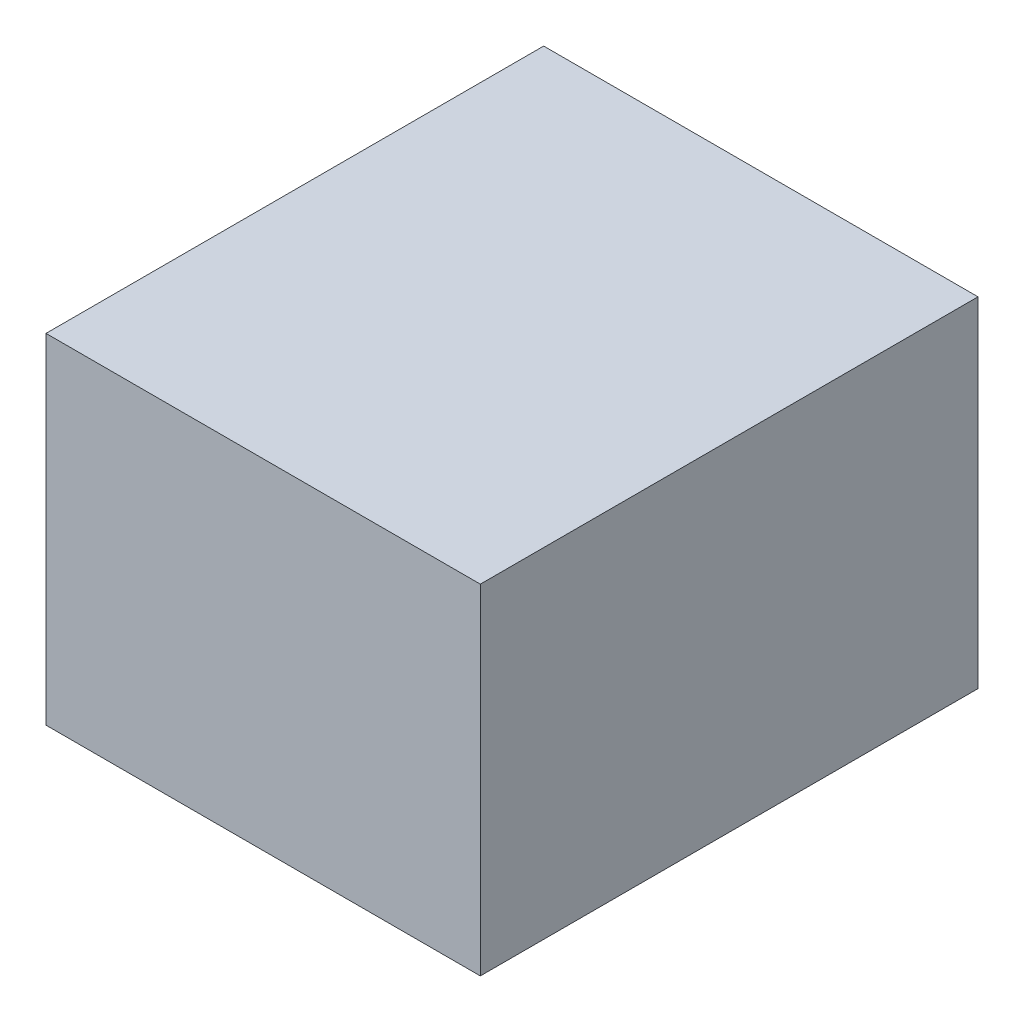
ISO-10303-21;
HEADER;
FILE_DESCRIPTION(('STEP AP214'),'2;1');
FILE_NAME('part.step','',(''),(''),'','','');
FILE_SCHEMA(('AUTOMOTIVE_DESIGN { 1 0 10303 214 1 1 1 1 }'));
ENDSEC;
DATA;
#1=APPLICATION_CONTEXT('core data for automotive mechanical design processes');
#2=APPLICATION_PROTOCOL_DEFINITION('international standard','automotive_design',2000,#1);
#3=PRODUCT_CONTEXT('',#1,'mechanical');
#4=PRODUCT('Part','Part','',(#3));
#5=PRODUCT_RELATED_PRODUCT_CATEGORY('part','',(#4));
#6=PRODUCT_DEFINITION_FORMATION('','',#4);
#7=PRODUCT_DEFINITION_CONTEXT('part definition',#1,'design');
#8=PRODUCT_DEFINITION('design','',#6,#7);
#9=PRODUCT_DEFINITION_SHAPE('','',#8);
#10=(LENGTH_UNIT() NAMED_UNIT(*) SI_UNIT(.MILLI.,.METRE.));
#11=(NAMED_UNIT(*) PLANE_ANGLE_UNIT() SI_UNIT($,.RADIAN.));
#12=(NAMED_UNIT(*) SI_UNIT($,.STERADIAN.) SOLID_ANGLE_UNIT());
#13=UNCERTAINTY_MEASURE_WITH_UNIT(LENGTH_MEASURE(1.E-05),#10,'distance_accuracy_value','');
#14=(GEOMETRIC_REPRESENTATION_CONTEXT(3) GLOBAL_UNCERTAINTY_ASSIGNED_CONTEXT((#13)) GLOBAL_UNIT_ASSIGNED_CONTEXT((#10,
#11,#12)) REPRESENTATION_CONTEXT('',''));
#15=CARTESIAN_POINT('',(0.,0.,0.));
#16=DIRECTION('',(0.,0.,1.));
#17=DIRECTION('',(1.,0.,0.));
#18=AXIS2_PLACEMENT_3D('',#15,#16,#17);
#19=CARTESIAN_POINT('',(24.,37.5,27.5));
#20=DIRECTION('',(-1.,0.,0.));
#21=DIRECTION('',(0.,0.,1.));
#22=AXIS2_PLACEMENT_3D('',#19,#20,#21);
#23=PLANE('',#22);
#24=DIRECTION('',(0.,0.,-1.));
#25=VECTOR('',#24,1.);
#26=CARTESIAN_POINT('',(24.,0.,27.5));
#27=LINE('',#26,#25);
#28=CARTESIAN_POINT('',(24.,0.,27.5));
#29=VERTEX_POINT('',#28);
#30=CARTESIAN_POINT('',(24.,0.,-27.5));
#31=VERTEX_POINT('',#30);
#32=EDGE_CURVE('E111',#29,#31,#27,.T.);
#33=ORIENTED_EDGE('',*,*,#32,.T.);
#34=DIRECTION('',(0.,-1.,0.));
#35=VECTOR('',#34,1.);
#36=CARTESIAN_POINT('',(24.,37.5,-27.5));
#37=LINE('',#36,#35);
#38=CARTESIAN_POINT('',(24.,37.5,-27.5));
#39=VERTEX_POINT('',#38);
#40=EDGE_CURVE('E11',#39,#31,#37,.T.);
#41=ORIENTED_EDGE('',*,*,#40,.F.);
#42=DIRECTION('',(0.,0.,-1.));
#43=VECTOR('',#42,1.);
#44=CARTESIAN_POINT('',(24.,37.5,27.5));
#45=LINE('',#44,#43);
#46=CARTESIAN_POINT('',(24.,37.5,27.5));
#47=VERTEX_POINT('',#46);
#48=EDGE_CURVE('E95',#47,#39,#45,.T.);
#49=ORIENTED_EDGE('',*,*,#48,.F.);
#50=DIRECTION('',(0.,-1.,0.));
#51=VECTOR('',#50,1.);
#52=CARTESIAN_POINT('',(24.,37.5,27.5));
#53=LINE('',#52,#51);
#54=EDGE_CURVE('E107',#47,#29,#53,.T.);
#55=ORIENTED_EDGE('',*,*,#54,.T.);
#56=EDGE_LOOP('',(#33,#41,#49,#55));
#57=FACE_BOUND('',#56,.T.);
#58=ADVANCED_FACE('F43',(#57),#23,.F.);
#59=CARTESIAN_POINT('',(-24.,37.5,-27.5));
#60=DIRECTION('',(0.,0.,1.));
#61=DIRECTION('',(1.,0.,0.));
#62=AXIS2_PLACEMENT_3D('',#59,#60,#61);
#63=PLANE('',#62);
#64=DIRECTION('',(-1.,0.,0.));
#65=VECTOR('',#64,1.);
#66=CARTESIAN_POINT('',(-24.,0.,-27.5));
#67=LINE('',#66,#65);
#68=CARTESIAN_POINT('',(-24.,0.,-27.5));
#69=VERTEX_POINT('',#68);
#70=EDGE_CURVE('E100',#31,#69,#67,.T.);
#71=ORIENTED_EDGE('',*,*,#70,.T.);
#72=DIRECTION('',(0.,-1.,0.));
#73=VECTOR('',#72,1.);
#74=CARTESIAN_POINT('',(-24.,37.5,-27.5));
#75=LINE('',#74,#73);
#76=CARTESIAN_POINT('',(-24.,37.5,-27.5));
#77=VERTEX_POINT('',#76);
#78=EDGE_CURVE('E52',#77,#69,#75,.T.);
#79=ORIENTED_EDGE('',*,*,#78,.F.);
#80=DIRECTION('',(-1.,0.,0.));
#81=VECTOR('',#80,1.);
#82=CARTESIAN_POINT('',(-24.,37.5,-27.5));
#83=LINE('',#82,#81);
#84=EDGE_CURVE('E90',#39,#77,#83,.T.);
#85=ORIENTED_EDGE('',*,*,#84,.F.);
#86=ORIENTED_EDGE('',*,*,#40,.T.);
#87=EDGE_LOOP('',(#71,#79,#85,#86));
#88=FACE_BOUND('',#87,.T.);
#89=ADVANCED_FACE('F99',(#88),#63,.F.);
#90=CARTESIAN_POINT('',(-24.,37.5,27.5));
#91=DIRECTION('',(1.,0.,0.));
#92=DIRECTION('',(0.,0.,-1.));
#93=AXIS2_PLACEMENT_3D('',#90,#91,#92);
#94=PLANE('',#93);
#95=DIRECTION('',(0.,0.,1.));
#96=VECTOR('',#95,1.);
#97=CARTESIAN_POINT('',(-24.,0.,27.5));
#98=LINE('',#97,#96);
#99=CARTESIAN_POINT('',(-24.,0.,27.5));
#100=VERTEX_POINT('',#99);
#101=EDGE_CURVE('E77',#69,#100,#98,.T.);
#102=ORIENTED_EDGE('',*,*,#101,.T.);
#103=DIRECTION('',(0.,-1.,0.));
#104=VECTOR('',#103,1.);
#105=CARTESIAN_POINT('',(-24.,37.5,27.5));
#106=LINE('',#105,#104);
#107=CARTESIAN_POINT('',(-24.,37.5,27.5));
#108=VERTEX_POINT('',#107);
#109=EDGE_CURVE('E102',#108,#100,#106,.T.);
#110=ORIENTED_EDGE('',*,*,#109,.F.);
#111=DIRECTION('',(0.,0.,1.));
#112=VECTOR('',#111,1.);
#113=CARTESIAN_POINT('',(-24.,37.5,27.5));
#114=LINE('',#113,#112);
#115=EDGE_CURVE('E93',#77,#108,#114,.T.);
#116=ORIENTED_EDGE('',*,*,#115,.F.);
#117=ORIENTED_EDGE('',*,*,#78,.T.);
#118=EDGE_LOOP('',(#102,#110,#116,#117));
#119=FACE_BOUND('',#118,.T.);
#120=ADVANCED_FACE('F103',(#119),#94,.F.);
#121=CARTESIAN_POINT('',(-24.,37.5,27.5));
#122=DIRECTION('',(0.,0.,-1.));
#123=DIRECTION('',(-1.,0.,0.));
#124=AXIS2_PLACEMENT_3D('',#121,#122,#123);
#125=PLANE('',#124);
#126=DIRECTION('',(1.,0.,0.));
#127=VECTOR('',#126,1.);
#128=CARTESIAN_POINT('',(-24.,0.,27.5));
#129=LINE('',#128,#127);
#130=EDGE_CURVE('E83',#100,#29,#129,.T.);
#131=ORIENTED_EDGE('',*,*,#130,.T.);
#132=ORIENTED_EDGE('',*,*,#54,.F.);
#133=DIRECTION('',(1.,0.,0.));
#134=VECTOR('',#133,1.);
#135=CARTESIAN_POINT('',(-24.,37.5,27.5));
#136=LINE('',#135,#134);
#137=EDGE_CURVE('E60',#108,#47,#136,.T.);
#138=ORIENTED_EDGE('',*,*,#137,.F.);
#139=ORIENTED_EDGE('',*,*,#109,.T.);
#140=EDGE_LOOP('',(#131,#132,#138,#139));
#141=FACE_BOUND('',#140,.T.);
#142=ADVANCED_FACE('F124',(#141),#125,.F.);
#143=CARTESIAN_POINT('',(0.,37.5,0.));
#144=DIRECTION('',(0.,-1.,0.));
#145=DIRECTION('',(0.,0.,-1.));
#146=AXIS2_PLACEMENT_3D('',#143,#144,#145);
#147=PLANE('',#146);
#148=ORIENTED_EDGE('',*,*,#48,.T.);
#149=ORIENTED_EDGE('',*,*,#84,.T.);
#150=ORIENTED_EDGE('',*,*,#115,.T.);
#151=ORIENTED_EDGE('',*,*,#137,.T.);
#152=EDGE_LOOP('',(#148,#149,#150,#151));
#153=FACE_BOUND('',#152,.T.);
#154=ADVANCED_FACE('F91',(#153),#147,.F.);
#155=CARTESIAN_POINT('',(0.,0.,0.));
#156=DIRECTION('',(0.,-1.,0.));
#157=DIRECTION('',(0.,0.,-1.));
#158=AXIS2_PLACEMENT_3D('',#155,#156,#157);
#159=PLANE('',#158);
#160=ORIENTED_EDGE('',*,*,#32,.F.);
#161=ORIENTED_EDGE('',*,*,#130,.F.);
#162=ORIENTED_EDGE('',*,*,#101,.F.);
#163=ORIENTED_EDGE('',*,*,#70,.F.);
#164=EDGE_LOOP('',(#160,#161,#162,#163));
#165=FACE_BOUND('',#164,.T.);
#166=ADVANCED_FACE('F127',(#165),#159,.T.);
#167=CLOSED_SHELL('',(#58,#89,#120,#142,#154,#166));
#168=MANIFOLD_SOLID_BREP('B2',#167);
#169=ADVANCED_BREP_SHAPE_REPRESENTATION('',(#18,#168),#14);
#170=SHAPE_DEFINITION_REPRESENTATION(#9,#169);
ENDSEC;
END-ISO-10303-21;
